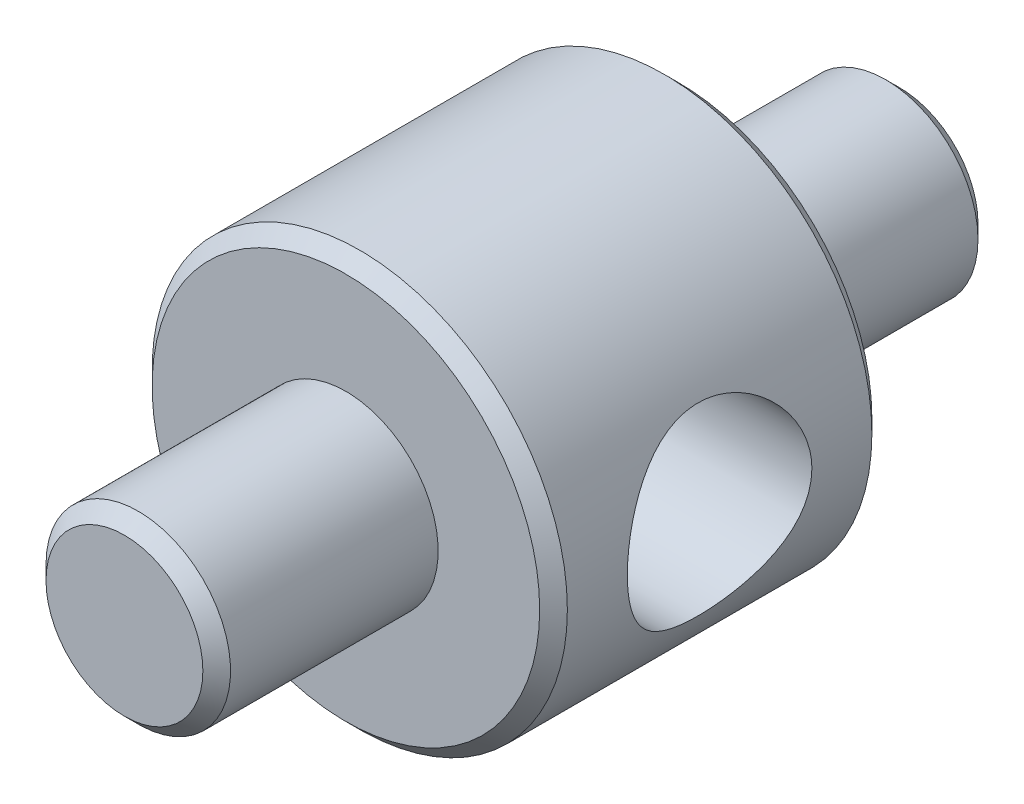
ISO-10303-21;
HEADER;
FILE_DESCRIPTION(('STEP AP214'),'2;1');
FILE_NAME('part.step','',(''),(''),'','','');
FILE_SCHEMA(('AUTOMOTIVE_DESIGN { 1 0 10303 214 1 1 1 1 }'));
ENDSEC;
DATA;
#1=APPLICATION_CONTEXT('core data for automotive mechanical design processes');
#2=APPLICATION_PROTOCOL_DEFINITION('international standard','automotive_design',2000,#1);
#3=PRODUCT_CONTEXT('',#1,'mechanical');
#4=PRODUCT('Part','Part','',(#3));
#5=PRODUCT_RELATED_PRODUCT_CATEGORY('part','',(#4));
#6=PRODUCT_DEFINITION_FORMATION('','',#4);
#7=PRODUCT_DEFINITION_CONTEXT('part definition',#1,'design');
#8=PRODUCT_DEFINITION('design','',#6,#7);
#9=PRODUCT_DEFINITION_SHAPE('','',#8);
#10=(LENGTH_UNIT() NAMED_UNIT(*) SI_UNIT(.MILLI.,.METRE.));
#11=(NAMED_UNIT(*) PLANE_ANGLE_UNIT() SI_UNIT($,.RADIAN.));
#12=(NAMED_UNIT(*) SI_UNIT($,.STERADIAN.) SOLID_ANGLE_UNIT());
#13=UNCERTAINTY_MEASURE_WITH_UNIT(LENGTH_MEASURE(1.E-05),#10,'distance_accuracy_value','');
#14=(GEOMETRIC_REPRESENTATION_CONTEXT(3) GLOBAL_UNCERTAINTY_ASSIGNED_CONTEXT((#13)) GLOBAL_UNIT_ASSIGNED_CONTEXT((#10,
#11,#12)) REPRESENTATION_CONTEXT('',''));
#15=CARTESIAN_POINT('',(0.,0.,0.));
#16=DIRECTION('',(0.,0.,1.));
#17=DIRECTION('',(1.,0.,0.));
#18=AXIS2_PLACEMENT_3D('',#15,#16,#17);
#19=CARTESIAN_POINT('',(0.,0.,18.));
#20=DIRECTION('',(0.,0.,-1.));
#21=DIRECTION('',(-1.,0.,0.));
#22=AXIS2_PLACEMENT_3D('',#19,#20,#21);
#23=CYLINDRICAL_SURFACE('',#22,22.5);
#24=CARTESIAN_POINT('',(0.,0.,-16.5));
#25=DIRECTION('',(0.,0.,1.));
#26=DIRECTION('',(1.,0.,0.));
#27=AXIS2_PLACEMENT_3D('',#24,#25,#26);
#28=CIRCLE('',#27,22.5);
#29=CARTESIAN_POINT('',(22.5,0.,-16.5));
#30=VERTEX_POINT('',#29);
#31=EDGE_CURVE('E49',#30,#30,#28,.T.);
#32=ORIENTED_EDGE('',*,*,#31,.T.);
#33=EDGE_LOOP('',(#32));
#34=FACE_BOUND('',#33,.T.);
#35=CARTESIAN_POINT('',(0.,0.,16.5));
#36=DIRECTION('',(0.,0.,1.));
#37=DIRECTION('',(1.,0.,0.));
#38=AXIS2_PLACEMENT_3D('',#35,#36,#37);
#39=CIRCLE('',#38,22.5);
#40=CARTESIAN_POINT('',(22.5,0.,16.5));
#41=VERTEX_POINT('',#40);
#42=EDGE_CURVE('E53',#41,#41,#39,.F.);
#43=ORIENTED_EDGE('',*,*,#42,.T.);
#44=EDGE_LOOP('',(#43));
#45=FACE_BOUND('',#44,.T.);
#46=CARTESIAN_POINT('',(-22.5,0.,-10.));
#47=CARTESIAN_POINT('',(-22.4999983412741,0.26635867450663,-9.99999801489142));
#48=CARTESIAN_POINT('',(-22.4952577550859,0.532785210886052,-9.98934407429766));
#49=CARTESIAN_POINT('',(-22.4764129887687,1.06372052827527,-9.94683332964316));
#50=CARTESIAN_POINT('',(-22.4623034599646,1.3282281265239,-9.91496441404969));
#51=CARTESIAN_POINT('',(-22.4250533191297,1.85378409880719,-9.83028307683902));
#52=CARTESIAN_POINT('',(-22.4018943007243,2.11482429416228,-9.77742796641402));
#53=CARTESIAN_POINT('',(-22.3471481148333,2.63103736565179,-9.65133414309113));
#54=CARTESIAN_POINT('',(-22.3155603486293,2.88620982358468,-9.57809398216803));
#55=CARTESIAN_POINT('',(-22.2448892220842,3.38804988474802,-9.41226320369187));
#56=CARTESIAN_POINT('',(-22.2058338172876,3.63474528214795,-9.31974464349954));
#57=CARTESIAN_POINT('',(-22.1211070120447,4.11911290035001,-9.11602719514624));
#58=CARTESIAN_POINT('',(-22.0754354056065,4.35678483992095,-9.00482772534838));
#59=CARTESIAN_POINT('',(-21.9785761888309,4.82167159326358,-8.76469499017571));
#60=CARTESIAN_POINT('',(-21.9273913187015,5.04889152249532,-8.63577052576966));
#61=CARTESIAN_POINT('',(-21.8206650853106,5.49186561087359,-8.36106562417567));
#62=CARTESIAN_POINT('',(-21.765122124065,5.70761551519559,-8.21527899474929));
#63=CARTESIAN_POINT('',(-21.5880568498737,6.35714242369688,-7.73850030503357));
#64=CARTESIAN_POINT('',(-21.4611409325697,6.76979822740148,-7.38012792068984));
#65=CARTESIAN_POINT('',(-21.2058946147112,7.53139326958646,-6.60114247843568));
#66=CARTESIAN_POINT('',(-21.0775634189794,7.88029452728653,-6.18049258800699));
#67=CARTESIAN_POINT('',(-20.8904888985783,8.35877756226239,-5.49676219265885));
#68=CARTESIAN_POINT('',(-20.8274141488895,8.51431075280241,-5.25266913044278));
#69=CARTESIAN_POINT('',(-20.706580039709,8.80409930019552,-4.75096387485482));
#70=CARTESIAN_POINT('',(-20.6488184651489,8.93836354110986,-4.49335738622679));
#71=CARTESIAN_POINT('',(-20.5405571154436,9.18442154561301,-3.96623247962893));
#72=CARTESIAN_POINT('',(-20.4900557283934,9.29622029918278,-3.69671672317796));
#73=CARTESIAN_POINT('',(-20.3981349149272,9.49622142398353,-3.14756074684071));
#74=CARTESIAN_POINT('',(-20.3567147069907,9.58442582587337,-2.86792140059931));
#75=CARTESIAN_POINT('',(-20.2864713022003,9.73218489954871,-2.3155897322206));
#76=CARTESIAN_POINT('',(-20.2571004246296,9.79300174905989,-2.04330481322032));
#77=CARTESIAN_POINT('',(-20.2090612627247,9.89175779481312,-1.4936771914048));
#78=CARTESIAN_POINT('',(-20.1903926080827,9.92969778262004,-1.21633466393058));
#79=CARTESIAN_POINT('',(-20.1644973394177,9.98217951008383,-0.659070013584595));
#80=CARTESIAN_POINT('',(-20.1572641728748,9.99673464930624,-0.379149460479338));
#81=CARTESIAN_POINT('',(-20.1545116933501,10.0022834901155,0.18097413212859));
#82=CARTESIAN_POINT('',(-20.1589916277639,9.99327870550299,0.461177152325461));
#83=CARTESIAN_POINT('',(-20.178556996954,9.95370553775352,0.994311539194443));
#84=CARTESIAN_POINT('',(-20.1926536074241,9.92514683895552,1.24743167715935));
#85=CARTESIAN_POINT('',(-20.2299357176033,9.84893398121707,1.75018866603186));
#86=CARTESIAN_POINT('',(-20.2531243076265,9.80127332950511,1.99982430266817));
#87=CARTESIAN_POINT('',(-20.3078519348151,9.68736967775726,2.49381495021869));
#88=CARTESIAN_POINT('',(-20.3393891895847,9.62113064392871,2.73817107625067));
#89=CARTESIAN_POINT('',(-20.4098821228145,9.47067093458347,3.22027775721418));
#90=CARTESIAN_POINT('',(-20.4488407242047,9.38644317253833,3.45802566705101));
#91=CARTESIAN_POINT('',(-20.5339927684761,9.19869507343532,3.93065940340294));
#92=CARTESIAN_POINT('',(-20.5803264052518,9.09479139530677,4.16536747547223));
#93=CARTESIAN_POINT('',(-20.6783222006865,8.86972683399476,4.62531422771477));
#94=CARTESIAN_POINT('',(-20.7299866437201,8.74855854398004,4.85054878958468));
#95=CARTESIAN_POINT('',(-20.8372968943357,8.48979808494964,5.29041076733051));
#96=CARTESIAN_POINT('',(-20.8929431658974,8.35220400067697,5.50503694212868));
#97=CARTESIAN_POINT('',(-21.0068589492686,8.06140567885882,5.9227107488607));
#98=CARTESIAN_POINT('',(-21.0651286283891,7.90820044490402,6.12575764043459));
#99=CARTESIAN_POINT('',(-21.1887005762833,7.57127612315423,6.53861837350061));
#100=CARTESIAN_POINT('',(-21.254133812688,7.38603823151229,6.74715584420609));
#101=CARTESIAN_POINT('',(-21.3847641683632,6.99882808584691,7.14800953933823));
#102=CARTESIAN_POINT('',(-21.4499613534205,6.79686094083624,7.34033068019162));
#103=CARTESIAN_POINT('',(-21.5784874997096,6.37707504510994,7.70783899814699));
#104=CARTESIAN_POINT('',(-21.6418151491746,6.15924551934532,7.88301433543273));
#105=CARTESIAN_POINT('',(-21.7648901464863,5.70911306089899,8.21487573203865));
#106=CARTESIAN_POINT('',(-21.8246389222671,5.47681597710944,8.37156918995315));
#107=CARTESIAN_POINT('',(-21.9407342792391,4.99181150591134,8.66978956457849));
#108=CARTESIAN_POINT('',(-21.9969259705791,4.73870176201837,8.81072380191944));
#109=CARTESIAN_POINT('',(-22.1022977955686,4.22000703014157,9.07059429202969));
#110=CARTESIAN_POINT('',(-22.1514777078841,3.95442164870328,9.18952985042369));
#111=CARTESIAN_POINT('',(-22.2413648148402,3.41277136658874,9.40413754279795));
#112=CARTESIAN_POINT('',(-22.2820763099849,3.13671186960292,9.49982148878462));
#113=CARTESIAN_POINT('',(-22.3538236970007,2.57611847726869,9.66690930787201));
#114=CARTESIAN_POINT('',(-22.3848604401935,2.29158532996721,9.73831531733953));
#115=CARTESIAN_POINT('',(-22.4344936419773,1.7365537918601,9.85184842232812));
#116=CARTESIAN_POINT('',(-22.4538085491569,1.46646625264618,9.89567445854468));
#117=CARTESIAN_POINT('',(-22.4827022481691,0.923093824753192,9.96106249991966));
#118=CARTESIAN_POINT('',(-22.492281491961,0.649809085093731,9.98262553859495));
#119=CARTESIAN_POINT('',(-22.5014327813663,0.102305199893462,10.0032275607149));
#120=CARTESIAN_POINT('',(-22.5010077394445,-0.171913650464062,10.0022730994924));
#121=CARTESIAN_POINT('',(-22.4901693364661,-0.719144891104905,9.97786740741689));
#122=CARTESIAN_POINT('',(-22.4797562573607,-0.992157315225745,9.95441681160476));
#123=CARTESIAN_POINT('',(-22.4501266532091,-1.51899158078639,9.88731655373121));
#124=CARTESIAN_POINT('',(-22.4314577903456,-1.77300551778788,9.84492197887201));
#125=CARTESIAN_POINT('',(-22.3859845778249,-2.2762980737003,9.74086726803527));
#126=CARTESIAN_POINT('',(-22.3591806218089,-2.52557692111295,9.6792080642313));
#127=CARTESIAN_POINT('',(-22.2980830127615,-3.0177798863728,9.53722228352213));
#128=CARTESIAN_POINT('',(-22.2637901456724,-3.26070466806966,9.45689766544831));
#129=CARTESIAN_POINT('',(-22.1884984795923,-3.7388693183974,9.27825549703403));
#130=CARTESIAN_POINT('',(-22.1474971105103,-3.97410620011854,9.17993104906421));
#131=CARTESIAN_POINT('',(-22.0583710838479,-4.44261938773791,8.96280280783393));
#132=CARTESIAN_POINT('',(-22.010065898814,-4.67561206078989,8.84346144460099));
#133=CARTESIAN_POINT('',(-21.908433598371,-5.13078390971222,8.58739045891613));
#134=CARTESIAN_POINT('',(-21.8551047719357,-5.35295936192739,8.4506549064971));
#135=CARTESIAN_POINT('',(-21.744642321343,-5.78535529571012,8.160725126261));
#136=CARTESIAN_POINT('',(-21.6875079761196,-5.99557349755944,8.00752777588658));
#137=CARTESIAN_POINT('',(-21.5707242991031,-6.40302886015366,7.68561275034613));
#138=CARTESIAN_POINT('',(-21.5110748459504,-6.60026539332612,7.51689432578923));
#139=CARTESIAN_POINT('',(-21.38572348661,-6.99623977160872,7.1506032700088));
#140=CARTESIAN_POINT('',(-21.3199221098287,-7.19381006998432,6.95180065996954));
#141=CARTESIAN_POINT('',(-21.1887052352925,-7.57157516822001,6.53832160675551));
#142=CARTESIAN_POINT('',(-21.1232896306177,-7.7517750176108,6.32364980895649));
#143=CARTESIAN_POINT('',(-20.9945797859484,-8.09388924179568,5.87942046829087));
#144=CARTESIAN_POINT('',(-20.9312865688396,-8.25579488629139,5.64985589991669));
#145=CARTESIAN_POINT('',(-20.8086644919195,-8.56016436228012,5.1771249604688));
#146=CARTESIAN_POINT('',(-20.7493361215172,-8.70262579589176,4.93395691700349));
#147=CARTESIAN_POINT('',(-20.6351213631841,-8.97014113507601,4.42944810766799));
#148=CARTESIAN_POINT('',(-20.5803743435446,-9.09469990199382,4.16781253194244));
#149=CARTESIAN_POINT('',(-20.4788579023647,-9.32103921932126,3.63350483395783));
#150=CARTESIAN_POINT('',(-20.4320847381341,-9.42283046316672,3.36083796423341));
#151=CARTESIAN_POINT('',(-20.3482468504859,-9.6025356438913,2.80645029954082));
#152=CARTESIAN_POINT('',(-20.3111766052706,-9.68046316559654,2.52473475698673));
#153=CARTESIAN_POINT('',(-20.2481926425272,-9.81152406599923,1.95437606654269));
#154=CARTESIAN_POINT('',(-20.222277664546,-9.86466024597034,1.66573370521908));
#155=CARTESIAN_POINT('',(-20.1843698111919,-9.94197643772676,1.10875008770604));
#156=CARTESIAN_POINT('',(-20.1713827745655,-9.96822966613534,0.840762703794267));
#157=CARTESIAN_POINT('',(-20.1561357409042,-9.99902478688881,0.303243244528135));
#158=CARTESIAN_POINT('',(-20.1538751110936,-10.0035679599608,0.0337112612325184));
#159=CARTESIAN_POINT('',(-20.1601645139545,-9.99088649900075,-0.5046580617197));
#160=CARTESIAN_POINT('',(-20.1687125217854,-9.97366594208629,-0.773495522032069));
#161=CARTESIAN_POINT('',(-20.196298945699,-9.91768517459673,-1.30836680601087));
#162=CARTESIAN_POINT('',(-20.2153371976009,-9.87892530112927,-1.57440067348938));
#163=CARTESIAN_POINT('',(-20.2617654840576,-9.78332716332782,-2.08566618198653));
#164=CARTESIAN_POINT('',(-20.2885807362236,-9.72772411668519,-2.33118280512387));
#165=CARTESIAN_POINT('',(-20.3500529208607,-9.59846160365254,-2.81649099138035));
#166=CARTESIAN_POINT('',(-20.3847125269139,-9.52479598029974,-3.05628057168104));
#167=CARTESIAN_POINT('',(-20.4608673563323,-9.36008167510315,-3.5286564779378));
#168=CARTESIAN_POINT('',(-20.5023616087251,-9.26903546216244,-3.76124382152049));
#169=CARTESIAN_POINT('',(-20.5910654560539,-9.07027346894596,-4.21808873074838));
#170=CARTESIAN_POINT('',(-20.6382771405329,-8.96255159020797,-4.44234321162514));
#171=CARTESIAN_POINT('',(-20.7930068459953,-8.60073036887333,-5.12891739777556));
#172=CARTESIAN_POINT('',(-20.9085624707511,-8.31840632323343,-5.5749207966406));
#173=CARTESIAN_POINT('',(-21.1482560424409,-7.68859265364666,-6.41574156812343));
#174=CARTESIAN_POINT('',(-21.2723975603181,-7.34107581132981,-6.8105374444338));
#175=CARTESIAN_POINT('',(-21.4615623012626,-6.76002102416189,-7.3745266720704));
#176=CARTESIAN_POINT('',(-21.5277465050087,-6.54670794344012,-7.56454357057132));
#177=CARTESIAN_POINT('',(-21.6573931597522,-6.10413045502065,-7.92597894664919));
#178=CARTESIAN_POINT('',(-21.7208564657984,-5.87487111875031,-8.09740329327398));
#179=CARTESIAN_POINT('',(-21.8433853752714,-5.40151273688932,-8.42056169047814));
#180=CARTESIAN_POINT('',(-21.9024477771704,-5.15740311817856,-8.57228146504076));
#181=CARTESIAN_POINT('',(-22.0144954122653,-4.65596026548334,-8.85464881838048));
#182=CARTESIAN_POINT('',(-22.0674811108367,-4.39862804632113,-8.98529801112928));
#183=CARTESIAN_POINT('',(-22.165327949851,-3.87534389039682,-9.22298029266647));
#184=CARTESIAN_POINT('',(-22.2102730712236,-3.60952001311623,-9.33026039701744));
#185=CARTESIAN_POINT('',(-22.2914633569308,-3.06846283264103,-9.52191574041082));
#186=CARTESIAN_POINT('',(-22.3277094716136,-2.79323056105034,-9.60629348162026));
#187=CARTESIAN_POINT('',(-22.3903507155281,-2.2361922261831,-9.75100247944083));
#188=CARTESIAN_POINT('',(-22.4167711762197,-1.95440508544984,-9.8113955983707));
#189=CARTESIAN_POINT('',(-22.4590737483085,-1.38603537042841,-9.90766770763661));
#190=CARTESIAN_POINT('',(-22.4749631808528,-1.09945626989596,-9.94356372881673));
#191=CARTESIAN_POINT('',(-22.4902249032581,-0.676807281398998,-9.97799030752754));
#192=CARTESIAN_POINT('',(-22.4938876174314,-0.541611708159801,-9.98624069441342));
#193=CARTESIAN_POINT('',(-22.4987756018156,-0.270949944583034,-9.99724607743069));
#194=CARTESIAN_POINT('',(-22.5000008437135,-0.135483751120319,-10.0000010097285));
#195=CARTESIAN_POINT('',(-22.5,0.,-10.));
#196=B_SPLINE_CURVE_WITH_KNOTS('',3,(#46,#47,#48,#49,#50,#51,#52,#53,#54,#55,#56,#57,#58,#59,
#60,#61,#62,#63,#64,#65,#66,#67,#68,#69,#70,#71,#72,#73,#74,#75,#76,#77,#78,#79,#80,#81,#82,#83,
#84,#85,#86,#87,#88,#89,#90,#91,#92,#93,#94,#95,#96,#97,#98,#99,#100,#101,#102,#103,#104,#105,
#106,#107,#108,#109,#110,#111,#112,#113,#114,#115,#116,#117,#118,#119,#120,#121,#122,#123,#124,
#125,#126,#127,#128,#129,#130,#131,#132,#133,#134,#135,#136,#137,#138,#139,#140,#141,#142,#143,
#144,#145,#146,#147,#148,#149,#150,#151,#152,#153,#154,#155,#156,#157,#158,#159,#160,#161,#162,
#163,#164,#165,#166,#167,#168,#169,#170,#171,#172,#173,#174,#175,#176,#177,#178,#179,#180,#181,
#182,#183,#184,#185,#186,#187,#188,#189,#190,#191,#192,#193,#194,#195),.UNSPECIFIED.,.T.,.F.,(4,
2,2,2,2,2,2,2,2,2,2,2,2,2,2,2,2,2,2,2,2,2,2,2,2,2,2,2,2,2,2,2,2,2,2,2,2,2,2,2,2,2,2,2,2,2,2,2,2,
2,2,2,2,2,2,2,2,2,2,2,2,2,2,2,2,2,2,2,2,2,2,2,2,2,4),(0.,0.798939988736113,1.59833648028422,
2.39936745399693,3.20045534241788,3.99860103417523,4.79677158109496,5.59454723518231,
6.39261678960634,8.06823192686052,9.74484205435458,10.6325756831291,11.5199375213358,
12.4071020424309,13.2941901847141,14.1346521822908,14.9750850972784,15.8150362705344,
16.6549334755631,17.4193840619599,18.1840947064805,18.9486422207896,19.713491480414,
20.495151264384,21.2771474099687,22.0592348259744,22.8413721914028,23.6999091725123,
24.5581849215304,25.4170492213531,26.2755685285796,27.1597265650927,28.0439125047716,
28.9276483274309,29.811306364534,30.6331401318182,31.4549357453345,32.2764921192689,
33.0980253022627,33.8717427906967,34.6454228464181,35.4190217453608,36.1929177143792,
36.9906540065471,37.7886629927483,38.5868236174462,39.3850227993026,40.2477471216788,
41.1102198918945,41.9731025254806,42.836091474737,43.7196246852545,44.6027420429537,
45.4853557326304,46.3678696680602,47.1755535918615,47.9831898679063,48.790674867494,
49.5981472296473,50.3567815506315,51.1156748265053,51.874460382119,52.6335240918381,
54.2474381734601,55.8620275792542,56.7408578711326,57.6194099332248,58.4985949995077,
59.377712689651,60.2470308231937,61.1162539422829,61.9832203267678,62.8495833641855,
63.2559607029152,63.6623427619733),.UNSPECIFIED.);
#197=CARTESIAN_POINT('',(-22.5,0.,-10.));
#198=VERTEX_POINT('',#197);
#199=EDGE_CURVE('E70',#198,#198,#196,.T.);
#200=ORIENTED_EDGE('',*,*,#199,.T.);
#201=EDGE_LOOP('',(#200));
#202=FACE_BOUND('',#201,.T.);
#203=CARTESIAN_POINT('',(22.5,0.,-10.));
#204=CARTESIAN_POINT('',(22.4999983412741,-0.26635867450663,-9.99999801489142));
#205=CARTESIAN_POINT('',(22.4952577550859,-0.532785210886054,-9.98934407429766));
#206=CARTESIAN_POINT('',(22.4764129887687,-1.06372052827527,-9.94683332964316));
#207=CARTESIAN_POINT('',(22.4623034599646,-1.3282281265239,-9.91496441404969));
#208=CARTESIAN_POINT('',(22.4250533191297,-1.8537840988072,-9.83028307683902));
#209=CARTESIAN_POINT('',(22.4018943007243,-2.11482429416229,-9.77742796641401));
#210=CARTESIAN_POINT('',(22.3471481148333,-2.6310373656518,-9.65133414309113));
#211=CARTESIAN_POINT('',(22.3155603486293,-2.88620982358468,-9.57809398216803));
#212=CARTESIAN_POINT('',(22.2448892220842,-3.38804988474802,-9.41226320369187));
#213=CARTESIAN_POINT('',(22.2058338172876,-3.63474528214795,-9.31974464349954));
#214=CARTESIAN_POINT('',(22.1211070120447,-4.11911290035002,-9.11602719514624));
#215=CARTESIAN_POINT('',(22.0754354056065,-4.35678483992095,-9.00482772534837));
#216=CARTESIAN_POINT('',(21.9785761888309,-4.82167159326359,-8.7646949901757));
#217=CARTESIAN_POINT('',(21.9273913187015,-5.04889152249533,-8.63577052576966));
#218=CARTESIAN_POINT('',(21.8206650853106,-5.4918656108736,-8.36106562417566));
#219=CARTESIAN_POINT('',(21.765122124065,-5.7076155151956,-8.21527899474929));
#220=CARTESIAN_POINT('',(21.5880568498737,-6.35714242369688,-7.73850030503356));
#221=CARTESIAN_POINT('',(21.4611409325697,-6.76979822740148,-7.38012792068983));
#222=CARTESIAN_POINT('',(21.2058946147112,-7.53139326958646,-6.60114247843568));
#223=CARTESIAN_POINT('',(21.0775634189794,-7.88029452728653,-6.18049258800698));
#224=CARTESIAN_POINT('',(20.8904888985783,-8.35877756226239,-5.49676219265884));
#225=CARTESIAN_POINT('',(20.8274141488895,-8.51431075280241,-5.25266913044277));
#226=CARTESIAN_POINT('',(20.706580039709,-8.80409930019552,-4.75096387485481));
#227=CARTESIAN_POINT('',(20.6488184651489,-8.93836354110986,-4.49335738622679));
#228=CARTESIAN_POINT('',(20.5405571154436,-9.18442154561301,-3.96623247962892));
#229=CARTESIAN_POINT('',(20.4900557283934,-9.29622029918278,-3.69671672317796));
#230=CARTESIAN_POINT('',(20.3981349149272,-9.49622142398353,-3.14756074684071));
#231=CARTESIAN_POINT('',(20.3567147069907,-9.58442582587337,-2.86792140059931));
#232=CARTESIAN_POINT('',(20.2864713022003,-9.73218489954871,-2.3155897322206));
#233=CARTESIAN_POINT('',(20.2571004246296,-9.79300174905989,-2.04330481322031));
#234=CARTESIAN_POINT('',(20.2090612627247,-9.89175779481313,-1.49367719140479));
#235=CARTESIAN_POINT('',(20.1903926080827,-9.92969778262004,-1.21633466393058));
#236=CARTESIAN_POINT('',(20.1644973394177,-9.98217951008384,-0.65907001358459));
#237=CARTESIAN_POINT('',(20.1572641728748,-9.99673464930624,-0.379149460479333));
#238=CARTESIAN_POINT('',(20.1545116933501,-10.0022834901155,0.180974132128595));
#239=CARTESIAN_POINT('',(20.1589916277639,-9.99327870550299,0.461177152325467));
#240=CARTESIAN_POINT('',(20.178556996954,-9.95370553775352,0.994311539194451));
#241=CARTESIAN_POINT('',(20.1926536074241,-9.92514683895552,1.24743167715936));
#242=CARTESIAN_POINT('',(20.2299357176033,-9.84893398121707,1.75018866603187));
#243=CARTESIAN_POINT('',(20.2531243076265,-9.80127332950511,1.99982430266817));
#244=CARTESIAN_POINT('',(20.3078519348151,-9.68736967775726,2.49381495021869));
#245=CARTESIAN_POINT('',(20.3393891895847,-9.62113064392871,2.73817107625067));
#246=CARTESIAN_POINT('',(20.4098821228145,-9.47067093458347,3.22027775721419));
#247=CARTESIAN_POINT('',(20.4488407242047,-9.38644317253833,3.45802566705101));
#248=CARTESIAN_POINT('',(20.5339927684761,-9.19869507343532,3.93065940340295));
#249=CARTESIAN_POINT('',(20.5803264052518,-9.09479139530677,4.16536747547223));
#250=CARTESIAN_POINT('',(20.6783222006865,-8.86972683399476,4.62531422771477));
#251=CARTESIAN_POINT('',(20.7299866437201,-8.74855854398004,4.85054878958468));
#252=CARTESIAN_POINT('',(20.8372968943357,-8.48979808494964,5.29041076733051));
#253=CARTESIAN_POINT('',(20.8929431658974,-8.35220400067696,5.50503694212868));
#254=CARTESIAN_POINT('',(21.0068589492686,-8.06140567885882,5.92271074886071));
#255=CARTESIAN_POINT('',(21.0651286283891,-7.90820044490402,6.12575764043459));
#256=CARTESIAN_POINT('',(21.1887005762833,-7.57127612315422,6.53861837350061));
#257=CARTESIAN_POINT('',(21.254133812688,-7.38603823151229,6.74715584420609));
#258=CARTESIAN_POINT('',(21.3847641683632,-6.9988280858469,7.14800953933823));
#259=CARTESIAN_POINT('',(21.4499613534205,-6.79686094083624,7.34033068019162));
#260=CARTESIAN_POINT('',(21.5784874997096,-6.37707504510994,7.70783899814699));
#261=CARTESIAN_POINT('',(21.6418151491746,-6.15924551934532,7.88301433543273));
#262=CARTESIAN_POINT('',(21.7648901464863,-5.70911306089899,8.21487573203865));
#263=CARTESIAN_POINT('',(21.8246389222671,-5.47681597710944,8.37156918995315));
#264=CARTESIAN_POINT('',(21.9407342792391,-4.99181150591134,8.66978956457849));
#265=CARTESIAN_POINT('',(21.9969259705791,-4.73870176201837,8.81072380191944));
#266=CARTESIAN_POINT('',(22.1022977955686,-4.22000703014157,9.07059429202969));
#267=CARTESIAN_POINT('',(22.1514777078841,-3.95442164870328,9.18952985042368));
#268=CARTESIAN_POINT('',(22.2413648148402,-3.41277136658874,9.40413754279795));
#269=CARTESIAN_POINT('',(22.2820763099849,-3.13671186960291,9.49982148878462));
#270=CARTESIAN_POINT('',(22.3538236970007,-2.57611847726869,9.66690930787201));
#271=CARTESIAN_POINT('',(22.3848604401935,-2.29158532996721,9.73831531733953));
#272=CARTESIAN_POINT('',(22.4344936419773,-1.7365537918601,9.85184842232812));
#273=CARTESIAN_POINT('',(22.4538085491569,-1.46646625264618,9.89567445854468));
#274=CARTESIAN_POINT('',(22.4827022481691,-0.923093824753192,9.96106249991966));
#275=CARTESIAN_POINT('',(22.492281491961,-0.649809085093731,9.98262553859495));
#276=CARTESIAN_POINT('',(22.5014327813663,-0.102305199893463,10.0032275607149));
#277=CARTESIAN_POINT('',(22.5010077394445,0.171913650464061,10.0022730994924));
#278=CARTESIAN_POINT('',(22.4901693364661,0.719144891104906,9.97786740741689));
#279=CARTESIAN_POINT('',(22.4797562573607,0.992157315225747,9.95441681160476));
#280=CARTESIAN_POINT('',(22.4501266532091,1.5189915807864,9.88731655373121));
#281=CARTESIAN_POINT('',(22.4314577903456,1.77300551778789,9.84492197887201));
#282=CARTESIAN_POINT('',(22.3859845778249,2.27629807370031,9.74086726803527));
#283=CARTESIAN_POINT('',(22.3591806218089,2.52557692111296,9.67920806423129));
#284=CARTESIAN_POINT('',(22.2980830127615,3.01777988637281,9.53722228352212));
#285=CARTESIAN_POINT('',(22.2637901456724,3.26070466806967,9.45689766544831));
#286=CARTESIAN_POINT('',(22.1884984795923,3.73886931839741,9.27825549703403));
#287=CARTESIAN_POINT('',(22.1474971105103,3.97410620011855,9.1799310490642));
#288=CARTESIAN_POINT('',(22.0583710838479,4.44261938773792,8.96280280783393));
#289=CARTESIAN_POINT('',(22.010065898814,4.67561206078991,8.84346144460099));
#290=CARTESIAN_POINT('',(21.908433598371,5.13078390971224,8.58739045891612));
#291=CARTESIAN_POINT('',(21.8551047719357,5.3529593619274,8.45065490649709));
#292=CARTESIAN_POINT('',(21.744642321343,5.78535529571013,8.16072512626099));
#293=CARTESIAN_POINT('',(21.6875079761196,5.99557349755945,8.00752777588657));
#294=CARTESIAN_POINT('',(21.5707242991031,6.40302886015367,7.68561275034612));
#295=CARTESIAN_POINT('',(21.5110748459504,6.60026539332613,7.51689432578922));
#296=CARTESIAN_POINT('',(21.38572348661,6.99623977160873,7.15060327000879));
#297=CARTESIAN_POINT('',(21.3199221098287,7.19381006998433,6.95180065996953));
#298=CARTESIAN_POINT('',(21.1887052352925,7.57157516822002,6.5383216067555));
#299=CARTESIAN_POINT('',(21.1232896306177,7.75177501761081,6.32364980895648));
#300=CARTESIAN_POINT('',(20.9945797859484,8.09388924179569,5.87942046829086));
#301=CARTESIAN_POINT('',(20.9312865688396,8.25579488629139,5.64985589991668));
#302=CARTESIAN_POINT('',(20.8086644919195,8.56016436228012,5.17712496046879));
#303=CARTESIAN_POINT('',(20.7493361215172,8.70262579589177,4.93395691700348));
#304=CARTESIAN_POINT('',(20.6351213631841,8.97014113507601,4.42944810766798));
#305=CARTESIAN_POINT('',(20.5803743435446,9.09469990199382,4.16781253194243));
#306=CARTESIAN_POINT('',(20.4788579023647,9.32103921932126,3.63350483395782));
#307=CARTESIAN_POINT('',(20.4320847381341,9.42283046316672,3.36083796423341));
#308=CARTESIAN_POINT('',(20.3482468504859,9.6025356438913,2.80645029954082));
#309=CARTESIAN_POINT('',(20.3111766052706,9.68046316559654,2.52473475698672));
#310=CARTESIAN_POINT('',(20.2481926425272,9.81152406599923,1.95437606654268));
#311=CARTESIAN_POINT('',(20.222277664546,9.86466024597034,1.66573370521908));
#312=CARTESIAN_POINT('',(20.1843698111919,9.94197643772676,1.10875008770604));
#313=CARTESIAN_POINT('',(20.1713827745655,9.96822966613534,0.840762703794262));
#314=CARTESIAN_POINT('',(20.1561357409042,9.99902478688881,0.303243244528131));
#315=CARTESIAN_POINT('',(20.1538751110936,10.0035679599608,0.033711261232514));
#316=CARTESIAN_POINT('',(20.1601645139545,9.99088649900075,-0.504658061719705));
#317=CARTESIAN_POINT('',(20.1687125217854,9.97366594208629,-0.773495522032075));
#318=CARTESIAN_POINT('',(20.196298945699,9.91768517459673,-1.30836680601087));
#319=CARTESIAN_POINT('',(20.2153371976009,9.87892530112927,-1.57440067348939));
#320=CARTESIAN_POINT('',(20.2617654840576,9.78332716332782,-2.08566618198654));
#321=CARTESIAN_POINT('',(20.2885807362236,9.72772411668519,-2.33118280512388));
#322=CARTESIAN_POINT('',(20.3500529208607,9.59846160365254,-2.81649099138036));
#323=CARTESIAN_POINT('',(20.3847125269139,9.52479598029973,-3.05628057168104));
#324=CARTESIAN_POINT('',(20.4608673563323,9.36008167510314,-3.52865647793781));
#325=CARTESIAN_POINT('',(20.5023616087251,9.26903546216244,-3.76124382152049));
#326=CARTESIAN_POINT('',(20.5910654560539,9.07027346894596,-4.21808873074838));
#327=CARTESIAN_POINT('',(20.6382771405329,8.96255159020797,-4.44234321162514));
#328=CARTESIAN_POINT('',(20.7930068459953,8.60073036887333,-5.12891739777556));
#329=CARTESIAN_POINT('',(20.9085624707511,8.31840632323343,-5.57492079664061));
#330=CARTESIAN_POINT('',(21.1482560424409,7.68859265364665,-6.41574156812343));
#331=CARTESIAN_POINT('',(21.2723975603181,7.34107581132981,-6.8105374444338));
#332=CARTESIAN_POINT('',(21.4615623012626,6.76002102416188,-7.3745266720704));
#333=CARTESIAN_POINT('',(21.5277465050087,6.54670794344011,-7.56454357057132));
#334=CARTESIAN_POINT('',(21.6573931597522,6.10413045502064,-7.92597894664919));
#335=CARTESIAN_POINT('',(21.7208564657984,5.87487111875031,-8.09740329327398));
#336=CARTESIAN_POINT('',(21.8433853752714,5.40151273688932,-8.42056169047815));
#337=CARTESIAN_POINT('',(21.9024477771704,5.15740311817855,-8.57228146504076));
#338=CARTESIAN_POINT('',(22.0144954122653,4.65596026548333,-8.85464881838048));
#339=CARTESIAN_POINT('',(22.0674811108367,4.39862804632113,-8.98529801112928));
#340=CARTESIAN_POINT('',(22.165327949851,3.87534389039682,-9.22298029266647));
#341=CARTESIAN_POINT('',(22.2102730712236,3.60952001311623,-9.33026039701744));
#342=CARTESIAN_POINT('',(22.2914633569308,3.06846283264102,-9.52191574041082));
#343=CARTESIAN_POINT('',(22.3277094716136,2.79323056105034,-9.60629348162026));
#344=CARTESIAN_POINT('',(22.3903507155281,2.23619222618309,-9.75100247944083));
#345=CARTESIAN_POINT('',(22.4167711762197,1.95440508544984,-9.81139559837071));
#346=CARTESIAN_POINT('',(22.4590737483085,1.3860353704284,-9.90766770763661));
#347=CARTESIAN_POINT('',(22.4749631808528,1.09945626989595,-9.94356372881673));
#348=CARTESIAN_POINT('',(22.4902249032581,0.676807281398995,-9.97799030752754));
#349=CARTESIAN_POINT('',(22.4938876174314,0.541611708159798,-9.98624069441342));
#350=CARTESIAN_POINT('',(22.4987756018156,0.270949944583033,-9.99724607743069));
#351=CARTESIAN_POINT('',(22.5000008437135,0.135483751120318,-10.0000010097285));
#352=CARTESIAN_POINT('',(22.5,0.,-10.));
#353=B_SPLINE_CURVE_WITH_KNOTS('',3,(#203,#204,#205,#206,#207,#208,#209,#210,#211,#212,#213,
#214,#215,#216,#217,#218,#219,#220,#221,#222,#223,#224,#225,#226,#227,#228,#229,#230,#231,#232,
#233,#234,#235,#236,#237,#238,#239,#240,#241,#242,#243,#244,#245,#246,#247,#248,#249,#250,#251,
#252,#253,#254,#255,#256,#257,#258,#259,#260,#261,#262,#263,#264,#265,#266,#267,#268,#269,#270,
#271,#272,#273,#274,#275,#276,#277,#278,#279,#280,#281,#282,#283,#284,#285,#286,#287,#288,#289,
#290,#291,#292,#293,#294,#295,#296,#297,#298,#299,#300,#301,#302,#303,#304,#305,#306,#307,#308,
#309,#310,#311,#312,#313,#314,#315,#316,#317,#318,#319,#320,#321,#322,#323,#324,#325,#326,#327,
#328,#329,#330,#331,#332,#333,#334,#335,#336,#337,#338,#339,#340,#341,#342,#343,#344,#345,#346,
#347,#348,#349,#350,#351,#352),.UNSPECIFIED.,.T.,.F.,(4,2,2,2,2,2,2,2,2,2,2,2,2,2,2,2,2,2,2,2,2,
2,2,2,2,2,2,2,2,2,2,2,2,2,2,2,2,2,2,2,2,2,2,2,2,2,2,2,2,2,2,2,2,2,2,2,2,2,2,2,2,2,2,2,2,2,2,2,2,
2,2,2,2,2,4),(0.,0.798939988736115,1.59833648028422,2.39936745399693,3.20045534241788,
3.99860103417524,4.79677158109496,5.59454723518232,6.39261678960634,8.06823192686053,
9.74484205435459,10.6325756831291,11.5199375213358,12.4071020424309,13.2941901847141,
14.1346521822908,14.9750850972784,15.8150362705344,16.6549334755631,17.4193840619599,
18.1840947064805,18.9486422207896,19.713491480414,20.495151264384,21.2771474099687,
22.0592348259744,22.8413721914028,23.6999091725123,24.5581849215304,25.4170492213531,
26.2755685285796,27.1597265650927,28.0439125047716,28.9276483274309,29.811306364534,
30.6331401318182,31.4549357453345,32.2764921192689,33.0980253022627,33.8717427906967,
34.6454228464181,35.4190217453608,36.1929177143792,36.9906540065471,37.7886629927483,
38.5868236174462,39.3850227993026,40.2477471216788,41.1102198918945,41.9731025254806,
42.836091474737,43.7196246852545,44.6027420429537,45.4853557326304,46.3678696680602,
47.1755535918615,47.9831898679063,48.790674867494,49.5981472296473,50.3567815506315,
51.1156748265053,51.874460382119,52.6335240918381,54.2474381734601,55.8620275792542,
56.7408578711326,57.6194099332248,58.4985949995077,59.377712689651,60.2470308231936,
61.1162539422829,61.9832203267678,62.8495833641855,63.2559607029152,63.6623427619733),.UNSPECIFIED.);
#354=CARTESIAN_POINT('',(22.5,0.,-10.));
#355=VERTEX_POINT('',#354);
#356=EDGE_CURVE('E78',#355,#355,#353,.T.);
#357=ORIENTED_EDGE('',*,*,#356,.T.);
#358=EDGE_LOOP('',(#357));
#359=FACE_BOUND('',#358,.T.);
#360=ADVANCED_FACE('F38',(#34,#45,#202,#359),#23,.T.);
#361=CARTESIAN_POINT('',(0.,0.,18.));
#362=DIRECTION('',(0.,0.,1.));
#363=DIRECTION('',(1.,0.,0.));
#364=AXIS2_PLACEMENT_3D('',#361,#362,#363);
#365=PLANE('',#364);
#366=CARTESIAN_POINT('',(0.,0.,18.));
#367=DIRECTION('',(0.,0.,1.));
#368=DIRECTION('',(1.,0.,0.));
#369=AXIS2_PLACEMENT_3D('',#366,#367,#368);
#370=CIRCLE('',#369,21.);
#371=CARTESIAN_POINT('',(21.,0.,18.));
#372=VERTEX_POINT('',#371);
#373=EDGE_CURVE('E10',#372,#372,#370,.T.);
#374=ORIENTED_EDGE('',*,*,#373,.T.);
#375=EDGE_LOOP('',(#374));
#376=FACE_BOUND('',#375,.T.);
#377=CARTESIAN_POINT('',(0.,0.,18.));
#378=DIRECTION('',(0.,0.,1.));
#379=DIRECTION('',(1.,0.,0.));
#380=AXIS2_PLACEMENT_3D('',#377,#378,#379);
#381=CIRCLE('',#380,10.);
#382=CARTESIAN_POINT('',(-10.,0.,18.));
#383=VERTEX_POINT('',#382);
#384=EDGE_CURVE('E127',#383,#383,#381,.F.);
#385=ORIENTED_EDGE('',*,*,#384,.T.);
#386=EDGE_LOOP('',(#385));
#387=FACE_BOUND('',#386,.T.);
#388=ADVANCED_FACE('F107',(#376,#387),#365,.T.);
#389=CARTESIAN_POINT('',(0.,0.,-18.));
#390=DIRECTION('',(0.,0.,1.));
#391=DIRECTION('',(1.,0.,0.));
#392=AXIS2_PLACEMENT_3D('',#389,#390,#391);
#393=PLANE('',#392);
#394=CARTESIAN_POINT('',(0.,0.,-18.));
#395=DIRECTION('',(0.,0.,1.));
#396=DIRECTION('',(1.,0.,0.));
#397=AXIS2_PLACEMENT_3D('',#394,#395,#396);
#398=CIRCLE('',#397,21.);
#399=CARTESIAN_POINT('',(21.,0.,-18.));
#400=VERTEX_POINT('',#399);
#401=EDGE_CURVE('E45',#400,#400,#398,.F.);
#402=ORIENTED_EDGE('',*,*,#401,.T.);
#403=EDGE_LOOP('',(#402));
#404=FACE_BOUND('',#403,.T.);
#405=CARTESIAN_POINT('',(0.,0.,-18.));
#406=DIRECTION('',(0.,0.,1.));
#407=DIRECTION('',(1.,0.,0.));
#408=AXIS2_PLACEMENT_3D('',#405,#406,#407);
#409=CIRCLE('',#408,10.);
#410=CARTESIAN_POINT('',(-10.,0.,-18.));
#411=VERTEX_POINT('',#410);
#412=EDGE_CURVE('E125',#411,#411,#409,.F.);
#413=ORIENTED_EDGE('',*,*,#412,.F.);
#414=EDGE_LOOP('',(#413));
#415=FACE_BOUND('',#414,.T.);
#416=ADVANCED_FACE('F102',(#404,#415),#393,.F.);
#417=CARTESIAN_POINT('',(0.,0.,-42.));
#418=DIRECTION('',(0.,0.,1.));
#419=DIRECTION('',(1.,0.,0.));
#420=AXIS2_PLACEMENT_3D('',#417,#418,#419);
#421=PLANE('',#420);
#422=CARTESIAN_POINT('',(0.,0.,-42.));
#423=DIRECTION('',(0.,0.,1.));
#424=DIRECTION('',(1.,0.,0.));
#425=AXIS2_PLACEMENT_3D('',#422,#423,#424);
#426=CIRCLE('',#425,8.49999999999996);
#427=CARTESIAN_POINT('',(8.49999999999996,0.,-42.));
#428=VERTEX_POINT('',#427);
#429=EDGE_CURVE('E58',#428,#428,#426,.F.);
#430=ORIENTED_EDGE('',*,*,#429,.T.);
#431=EDGE_LOOP('',(#430));
#432=FACE_BOUND('',#431,.T.);
#433=ADVANCED_FACE('F98',(#432),#421,.F.);
#434=CARTESIAN_POINT('',(0.,0.,42.));
#435=DIRECTION('',(0.,0.,-1.));
#436=DIRECTION('',(-1.,0.,0.));
#437=AXIS2_PLACEMENT_3D('',#434,#435,#436);
#438=CYLINDRICAL_SURFACE('',#437,10.);
#439=CARTESIAN_POINT('',(0.,0.,-40.5));
#440=DIRECTION('',(0.,0.,1.));
#441=DIRECTION('',(1.,0.,0.));
#442=AXIS2_PLACEMENT_3D('',#439,#440,#441);
#443=CIRCLE('',#442,10.);
#444=CARTESIAN_POINT('',(-10.,0.,-40.5));
#445=VERTEX_POINT('',#444);
#446=EDGE_CURVE('E61',#445,#445,#443,.T.);
#447=CARTESIAN_POINT('',(-10.,0.,-40.5));
#448=CARTESIAN_POINT('',(-10.,0.,-40.265625));
#449=CARTESIAN_POINT('',(-10.,0.,-40.03125));
#450=CARTESIAN_POINT('',(-10.,0.,-39.5625));
#451=CARTESIAN_POINT('',(-10.,0.,-39.328125));
#452=CARTESIAN_POINT('',(-10.,0.,-38.859375));
#453=CARTESIAN_POINT('',(-10.,0.,-38.625));
#454=CARTESIAN_POINT('',(-10.,0.,-38.15625));
#455=CARTESIAN_POINT('',(-10.,0.,-37.921875));
#456=CARTESIAN_POINT('',(-10.,0.,-37.453125));
#457=CARTESIAN_POINT('',(-10.,0.,-37.21875));
#458=CARTESIAN_POINT('',(-10.,0.,-36.75));
#459=CARTESIAN_POINT('',(-10.,0.,-36.515625));
#460=CARTESIAN_POINT('',(-10.,0.,-36.046875));
#461=CARTESIAN_POINT('',(-10.,0.,-35.8125));
#462=CARTESIAN_POINT('',(-10.,0.,-35.34375));
#463=CARTESIAN_POINT('',(-10.,0.,-35.109375));
#464=CARTESIAN_POINT('',(-10.,0.,-34.640625));
#465=CARTESIAN_POINT('',(-10.,0.,-34.40625));
#466=CARTESIAN_POINT('',(-10.,0.,-33.9375));
#467=CARTESIAN_POINT('',(-10.,0.,-33.703125));
#468=CARTESIAN_POINT('',(-10.,0.,-33.234375));
#469=CARTESIAN_POINT('',(-10.,0.,-33.));
#470=CARTESIAN_POINT('',(-10.,0.,-32.53125));
#471=CARTESIAN_POINT('',(-10.,0.,-32.296875));
#472=CARTESIAN_POINT('',(-10.,0.,-31.828125));
#473=CARTESIAN_POINT('',(-10.,0.,-31.59375));
#474=CARTESIAN_POINT('',(-10.,0.,-31.125));
#475=CARTESIAN_POINT('',(-10.,0.,-30.890625));
#476=CARTESIAN_POINT('',(-10.,0.,-30.421875));
#477=CARTESIAN_POINT('',(-10.,0.,-30.1875));
#478=CARTESIAN_POINT('',(-10.,0.,-29.71875));
#479=CARTESIAN_POINT('',(-10.,0.,-29.484375));
#480=CARTESIAN_POINT('',(-10.,0.,-29.015625));
#481=CARTESIAN_POINT('',(-10.,0.,-28.78125));
#482=CARTESIAN_POINT('',(-10.,0.,-28.3125));
#483=CARTESIAN_POINT('',(-10.,0.,-28.078125));
#484=CARTESIAN_POINT('',(-10.,0.,-27.609375));
#485=CARTESIAN_POINT('',(-10.,0.,-27.375));
#486=CARTESIAN_POINT('',(-10.,0.,-26.90625));
#487=CARTESIAN_POINT('',(-10.,0.,-26.671875));
#488=CARTESIAN_POINT('',(-10.,0.,-26.203125));
#489=CARTESIAN_POINT('',(-10.,0.,-25.96875));
#490=CARTESIAN_POINT('',(-10.,0.,-25.5));
#491=CARTESIAN_POINT('',(-10.,0.,-25.265625));
#492=CARTESIAN_POINT('',(-10.,0.,-24.796875));
#493=CARTESIAN_POINT('',(-10.,0.,-24.5625));
#494=CARTESIAN_POINT('',(-10.,0.,-24.09375));
#495=CARTESIAN_POINT('',(-10.,0.,-23.859375));
#496=CARTESIAN_POINT('',(-10.,0.,-23.390625));
#497=CARTESIAN_POINT('',(-10.,0.,-23.15625));
#498=CARTESIAN_POINT('',(-10.,0.,-22.6875));
#499=CARTESIAN_POINT('',(-10.,0.,-22.453125));
#500=CARTESIAN_POINT('',(-10.,0.,-21.984375));
#501=CARTESIAN_POINT('',(-10.,0.,-21.75));
#502=CARTESIAN_POINT('',(-10.,0.,-21.28125));
#503=CARTESIAN_POINT('',(-10.,0.,-21.046875));
#504=CARTESIAN_POINT('',(-10.,0.,-20.578125));
#505=CARTESIAN_POINT('',(-10.,0.,-20.34375));
#506=CARTESIAN_POINT('',(-10.,0.,-19.875));
#507=CARTESIAN_POINT('',(-10.,0.,-19.640625));
#508=CARTESIAN_POINT('',(-10.,0.,-19.171875));
#509=CARTESIAN_POINT('',(-10.,0.,-18.9375));
#510=CARTESIAN_POINT('',(-10.,0.,-18.46875));
#511=CARTESIAN_POINT('',(-10.,0.,-18.234375));
#512=CARTESIAN_POINT('',(-10.,0.,-18.));
#513=B_SPLINE_CURVE_WITH_KNOTS('',3,(#447,#448,#449,#450,#451,#452,#453,#454,#455,#456,#457,
#458,#459,#460,#461,#462,#463,#464,#465,#466,#467,#468,#469,#470,#471,#472,#473,#474,#475,#476,
#477,#478,#479,#480,#481,#482,#483,#484,#485,#486,#487,#488,#489,#490,#491,#492,#493,#494,#495,
#496,#497,#498,#499,#500,#501,#502,#503,#504,#505,#506,#507,#508,#509,#510,#511,#512),
.UNSPECIFIED.,.F.,.F.,(4,2,2,2,2,2,2,2,2,2,2,2,2,2,2,2,2,2,2,2,2,2,2,2,2,2,2,2,2,2,2,2,4),(0.,
0.703124999999999,1.40625,2.109375,2.8125,3.51562499999999,4.21874999999999,4.92187499999999,
5.62499999999999,6.32812499999999,7.03124999999999,7.73437499999999,8.43749999999999,
9.14062499999999,9.84374999999998,10.546875,11.25,11.953125,12.65625,13.359375,14.0625,
14.765625,15.46875,16.171875,16.875,17.578125,18.28125,18.984375,19.6875,20.390625,21.09375,
21.796875,22.5),.UNSPECIFIED.);
#514=EDGE_CURVE('BSEAM101',#445,#411,#513,.T.);
#515=ORIENTED_EDGE('',*,*,#446,.T.);
#516=ORIENTED_EDGE('',*,*,#412,.T.);
#517=ORIENTED_EDGE('',*,*,#514,.T.);
#518=ORIENTED_EDGE('',*,*,#514,.F.);
#519=EDGE_LOOP('',(#515,#517,#516,#518));
#520=FACE_BOUND('',#519,.T.);
#521=ADVANCED_FACE('F101',(#520),#438,.T.);
#522=CARTESIAN_POINT('',(0.,0.,40.5));
#523=DIRECTION('',(0.,0.,1.));
#524=DIRECTION('',(1.,0.,0.));
#525=AXIS2_PLACEMENT_3D('',#522,#523,#524);
#526=CIRCLE('',#525,10.);
#527=CARTESIAN_POINT('',(-10.,0.,40.5));
#528=VERTEX_POINT('',#527);
#529=EDGE_CURVE('E64',#528,#528,#526,.F.);
#530=CARTESIAN_POINT('',(-10.,0.,40.5));
#531=CARTESIAN_POINT('',(-10.,0.,40.265625));
#532=CARTESIAN_POINT('',(-10.,0.,40.03125));
#533=CARTESIAN_POINT('',(-10.,0.,39.5625));
#534=CARTESIAN_POINT('',(-10.,0.,39.328125));
#535=CARTESIAN_POINT('',(-10.,0.,38.859375));
#536=CARTESIAN_POINT('',(-10.,0.,38.625));
#537=CARTESIAN_POINT('',(-10.,0.,38.15625));
#538=CARTESIAN_POINT('',(-10.,0.,37.921875));
#539=CARTESIAN_POINT('',(-10.,0.,37.453125));
#540=CARTESIAN_POINT('',(-10.,0.,37.21875));
#541=CARTESIAN_POINT('',(-10.,0.,36.75));
#542=CARTESIAN_POINT('',(-10.,0.,36.515625));
#543=CARTESIAN_POINT('',(-10.,0.,36.046875));
#544=CARTESIAN_POINT('',(-10.,0.,35.8125));
#545=CARTESIAN_POINT('',(-10.,0.,35.34375));
#546=CARTESIAN_POINT('',(-10.,0.,35.109375));
#547=CARTESIAN_POINT('',(-10.,0.,34.640625));
#548=CARTESIAN_POINT('',(-10.,0.,34.40625));
#549=CARTESIAN_POINT('',(-10.,0.,33.9375));
#550=CARTESIAN_POINT('',(-10.,0.,33.703125));
#551=CARTESIAN_POINT('',(-10.,0.,33.234375));
#552=CARTESIAN_POINT('',(-10.,0.,33.));
#553=CARTESIAN_POINT('',(-10.,0.,32.53125));
#554=CARTESIAN_POINT('',(-10.,0.,32.296875));
#555=CARTESIAN_POINT('',(-10.,0.,31.828125));
#556=CARTESIAN_POINT('',(-10.,0.,31.59375));
#557=CARTESIAN_POINT('',(-10.,0.,31.125));
#558=CARTESIAN_POINT('',(-10.,0.,30.890625));
#559=CARTESIAN_POINT('',(-10.,0.,30.421875));
#560=CARTESIAN_POINT('',(-10.,0.,30.1875));
#561=CARTESIAN_POINT('',(-10.,0.,29.71875));
#562=CARTESIAN_POINT('',(-10.,0.,29.484375));
#563=CARTESIAN_POINT('',(-10.,0.,29.015625));
#564=CARTESIAN_POINT('',(-10.,0.,28.78125));
#565=CARTESIAN_POINT('',(-10.,0.,28.3125));
#566=CARTESIAN_POINT('',(-10.,0.,28.078125));
#567=CARTESIAN_POINT('',(-10.,0.,27.609375));
#568=CARTESIAN_POINT('',(-10.,0.,27.375));
#569=CARTESIAN_POINT('',(-10.,0.,26.90625));
#570=CARTESIAN_POINT('',(-10.,0.,26.671875));
#571=CARTESIAN_POINT('',(-10.,0.,26.203125));
#572=CARTESIAN_POINT('',(-10.,0.,25.96875));
#573=CARTESIAN_POINT('',(-10.,0.,25.5));
#574=CARTESIAN_POINT('',(-10.,0.,25.265625));
#575=CARTESIAN_POINT('',(-10.,0.,24.796875));
#576=CARTESIAN_POINT('',(-10.,0.,24.5625));
#577=CARTESIAN_POINT('',(-10.,0.,24.09375));
#578=CARTESIAN_POINT('',(-10.,0.,23.859375));
#579=CARTESIAN_POINT('',(-10.,0.,23.390625));
#580=CARTESIAN_POINT('',(-10.,0.,23.15625));
#581=CARTESIAN_POINT('',(-10.,0.,22.6875));
#582=CARTESIAN_POINT('',(-10.,0.,22.453125));
#583=CARTESIAN_POINT('',(-10.,0.,21.984375));
#584=CARTESIAN_POINT('',(-10.,0.,21.75));
#585=CARTESIAN_POINT('',(-10.,0.,21.28125));
#586=CARTESIAN_POINT('',(-10.,0.,21.046875));
#587=CARTESIAN_POINT('',(-10.,0.,20.578125));
#588=CARTESIAN_POINT('',(-10.,0.,20.34375));
#589=CARTESIAN_POINT('',(-10.,0.,19.875));
#590=CARTESIAN_POINT('',(-10.,0.,19.640625));
#591=CARTESIAN_POINT('',(-10.,0.,19.171875));
#592=CARTESIAN_POINT('',(-10.,0.,18.9375));
#593=CARTESIAN_POINT('',(-10.,0.,18.46875));
#594=CARTESIAN_POINT('',(-10.,0.,18.234375));
#595=CARTESIAN_POINT('',(-10.,0.,18.));
#596=B_SPLINE_CURVE_WITH_KNOTS('',3,(#530,#531,#532,#533,#534,#535,#536,#537,#538,#539,#540,
#541,#542,#543,#544,#545,#546,#547,#548,#549,#550,#551,#552,#553,#554,#555,#556,#557,#558,#559,
#560,#561,#562,#563,#564,#565,#566,#567,#568,#569,#570,#571,#572,#573,#574,#575,#576,#577,#578,
#579,#580,#581,#582,#583,#584,#585,#586,#587,#588,#589,#590,#591,#592,#593,#594,#595),
.UNSPECIFIED.,.F.,.F.,(4,2,2,2,2,2,2,2,2,2,2,2,2,2,2,2,2,2,2,2,2,2,2,2,2,2,2,2,2,2,2,2,4),(0.,
0.703125000000006,1.40625,2.109375,2.81250000000001,3.51562500000001,4.21875000000001,
4.92187500000001,5.62500000000001,6.32812500000001,7.03125000000002,7.73437500000002,
8.43750000000002,9.14062500000002,9.84375000000002,10.546875,11.25,11.953125,12.65625,13.359375,
14.0625,14.765625,15.46875,16.171875,16.875,17.578125,18.28125,18.984375,19.6875,20.390625,
21.09375,21.796875,22.5),.UNSPECIFIED.);
#597=EDGE_CURVE('BSEAM96',#528,#383,#596,.T.);
#598=ORIENTED_EDGE('',*,*,#529,.T.);
#599=ORIENTED_EDGE('',*,*,#384,.F.);
#600=ORIENTED_EDGE('',*,*,#597,.T.);
#601=ORIENTED_EDGE('',*,*,#597,.F.);
#602=EDGE_LOOP('',(#598,#600,#599,#601));
#603=FACE_BOUND('',#602,.T.);
#604=ADVANCED_FACE('F96',(#603),#438,.T.);
#605=CARTESIAN_POINT('',(0.,0.,42.));
#606=DIRECTION('',(0.,0.,1.));
#607=DIRECTION('',(1.,0.,0.));
#608=AXIS2_PLACEMENT_3D('',#605,#606,#607);
#609=PLANE('',#608);
#610=CARTESIAN_POINT('',(0.,0.,42.));
#611=DIRECTION('',(0.,0.,1.));
#612=DIRECTION('',(1.,0.,0.));
#613=AXIS2_PLACEMENT_3D('',#610,#611,#612);
#614=CIRCLE('',#613,8.50000000000005);
#615=CARTESIAN_POINT('',(8.50000000000005,0.,42.));
#616=VERTEX_POINT('',#615);
#617=EDGE_CURVE('E67',#616,#616,#614,.T.);
#618=ORIENTED_EDGE('',*,*,#617,.T.);
#619=EDGE_LOOP('',(#618));
#620=FACE_BOUND('',#619,.T.);
#621=ADVANCED_FACE('F91',(#620),#609,.T.);
#622=CARTESIAN_POINT('',(-22.5,0.,0.));
#623=DIRECTION('',(1.,0.,0.));
#624=DIRECTION('',(0.,0.,-1.));
#625=AXIS2_PLACEMENT_3D('',#622,#623,#624);
#626=CYLINDRICAL_SURFACE('',#625,10.);
#627=ORIENTED_EDGE('',*,*,#356,.F.);
#628=EDGE_LOOP('',(#627));
#629=FACE_BOUND('',#628,.T.);
#630=ORIENTED_EDGE('',*,*,#199,.F.);
#631=EDGE_LOOP('',(#630));
#632=FACE_BOUND('',#631,.T.);
#633=ADVANCED_FACE('F86',(#629,#632),#626,.F.);
#634=CARTESIAN_POINT('',(0.,0.,42.));
#635=DIRECTION('',(0.,0.,-1.));
#636=DIRECTION('',(-1.,0.,0.));
#637=AXIS2_PLACEMENT_3D('',#634,#635,#636);
#638=CONICAL_SURFACE('',#637,8.50000000000005,0.785398163397445);
#639=ORIENTED_EDGE('',*,*,#529,.F.);
#640=EDGE_LOOP('',(#639));
#641=FACE_BOUND('',#640,.T.);
#642=ORIENTED_EDGE('',*,*,#617,.F.);
#643=EDGE_LOOP('',(#642));
#644=FACE_BOUND('',#643,.T.);
#645=ADVANCED_FACE('F90',(#641,#644),#638,.T.);
#646=CARTESIAN_POINT('',(0.,0.,-40.5));
#647=DIRECTION('',(0.,0.,1.));
#648=DIRECTION('',(1.,0.,0.));
#649=AXIS2_PLACEMENT_3D('',#646,#647,#648);
#650=CONICAL_SURFACE('',#649,10.,0.78539816339745);
#651=ORIENTED_EDGE('',*,*,#429,.F.);
#652=EDGE_LOOP('',(#651));
#653=FACE_BOUND('',#652,.T.);
#654=ORIENTED_EDGE('',*,*,#446,.F.);
#655=EDGE_LOOP('',(#654));
#656=FACE_BOUND('',#655,.T.);
#657=ADVANCED_FACE('F141',(#653,#656),#650,.T.);
#658=CARTESIAN_POINT('',(0.,0.,-16.5));
#659=DIRECTION('',(0.,0.,1.));
#660=DIRECTION('',(1.,0.,0.));
#661=AXIS2_PLACEMENT_3D('',#658,#659,#660);
#662=CONICAL_SURFACE('',#661,22.5,0.785398163397453);
#663=ORIENTED_EDGE('',*,*,#401,.F.);
#664=EDGE_LOOP('',(#663));
#665=FACE_BOUND('',#664,.T.);
#666=ORIENTED_EDGE('',*,*,#31,.F.);
#667=EDGE_LOOP('',(#666));
#668=FACE_BOUND('',#667,.T.);
#669=ADVANCED_FACE('F143',(#665,#668),#662,.T.);
#670=CARTESIAN_POINT('',(0.,0.,18.));
#671=DIRECTION('',(0.,0.,-1.));
#672=DIRECTION('',(-1.,0.,0.));
#673=AXIS2_PLACEMENT_3D('',#670,#671,#672);
#674=CONICAL_SURFACE('',#673,21.,0.785398163397447);
#675=ORIENTED_EDGE('',*,*,#42,.F.);
#676=EDGE_LOOP('',(#675));
#677=FACE_BOUND('',#676,.T.);
#678=ORIENTED_EDGE('',*,*,#373,.F.);
#679=EDGE_LOOP('',(#678));
#680=FACE_BOUND('',#679,.T.);
#681=ADVANCED_FACE('F40',(#677,#680),#674,.T.);
#682=CLOSED_SHELL('',(#360,#388,#416,#433,#521,#604,#621,#633,#645,#657,#669,#681));
#683=MANIFOLD_SOLID_BREP('B2',#682);
#684=ADVANCED_BREP_SHAPE_REPRESENTATION('',(#18,#683),#14);
#685=SHAPE_DEFINITION_REPRESENTATION(#9,#684);
ENDSEC;
END-ISO-10303-21;
